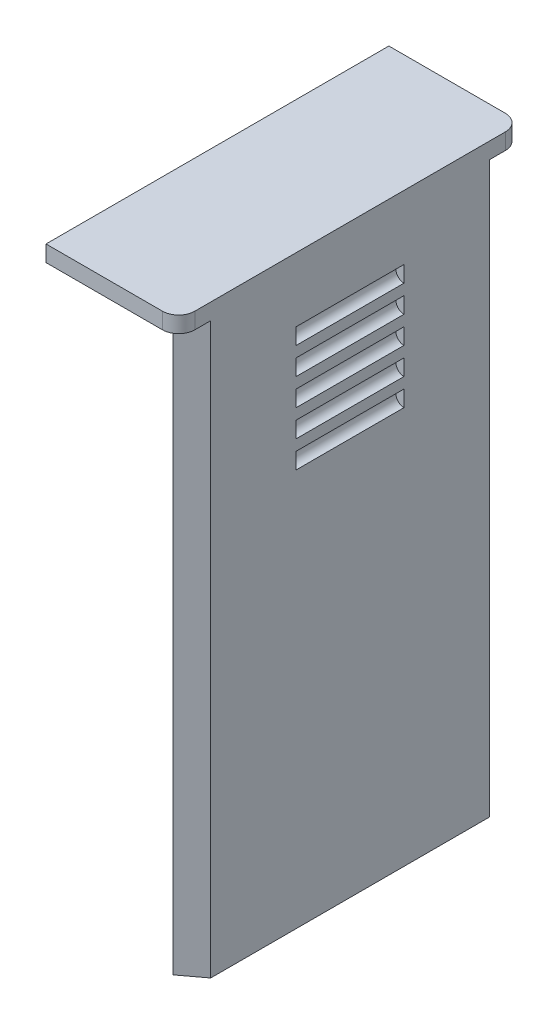
ISO-10303-21;
HEADER;
FILE_DESCRIPTION(('STEP AP214'),'2;1');
FILE_NAME('part.step','',(''),(''),'','','');
FILE_SCHEMA(('AUTOMOTIVE_DESIGN { 1 0 10303 214 1 1 1 1 }'));
ENDSEC;
DATA;
#1=APPLICATION_CONTEXT('core data for automotive mechanical design processes');
#2=APPLICATION_PROTOCOL_DEFINITION('international standard','automotive_design',2000,#1);
#3=PRODUCT_CONTEXT('',#1,'mechanical');
#4=PRODUCT('Part','Part','',(#3));
#5=PRODUCT_RELATED_PRODUCT_CATEGORY('part','',(#4));
#6=PRODUCT_DEFINITION_FORMATION('','',#4);
#7=PRODUCT_DEFINITION_CONTEXT('part definition',#1,'design');
#8=PRODUCT_DEFINITION('design','',#6,#7);
#9=PRODUCT_DEFINITION_SHAPE('','',#8);
#10=(LENGTH_UNIT() NAMED_UNIT(*) SI_UNIT(.MILLI.,.METRE.));
#11=(NAMED_UNIT(*) PLANE_ANGLE_UNIT() SI_UNIT($,.RADIAN.));
#12=(NAMED_UNIT(*) SI_UNIT($,.STERADIAN.) SOLID_ANGLE_UNIT());
#13=UNCERTAINTY_MEASURE_WITH_UNIT(LENGTH_MEASURE(1.E-05),#10,'distance_accuracy_value','');
#14=(GEOMETRIC_REPRESENTATION_CONTEXT(3) GLOBAL_UNCERTAINTY_ASSIGNED_CONTEXT((#13)) GLOBAL_UNIT_ASSIGNED_CONTEXT((#10,
#11,#12)) REPRESENTATION_CONTEXT('',''));
#15=CARTESIAN_POINT('',(0.,0.,0.));
#16=DIRECTION('',(0.,0.,1.));
#17=DIRECTION('',(1.,0.,0.));
#18=AXIS2_PLACEMENT_3D('',#15,#16,#17);
#19=CARTESIAN_POINT('',(-3.65222941321836,109.967949424705,104.21839123638));
#20=DIRECTION('',(1.,0.,0.));
#21=DIRECTION('',(0.,0.,-1.));
#22=AXIS2_PLACEMENT_3D('',#19,#20,#21);
#23=PLANE('',#22);
#24=DIRECTION('',(0.,0.,1.));
#25=VECTOR('',#24,1.);
#26=CARTESIAN_POINT('',(-3.65222941321836,98.017949424705,83.3183912363796));
#27=LINE('',#26,#25);
#28=CARTESIAN_POINT('',(-3.65222941321836,98.017949424705,83.3183912363796));
#29=VERTEX_POINT('',#28);
#30=CARTESIAN_POINT('',(-3.65222941321836,98.017949424705,93.3183912363796));
#31=VERTEX_POINT('',#30);
#32=EDGE_CURVE('E507',#29,#31,#27,.T.);
#33=ORIENTED_EDGE('',*,*,#32,.F.);
#34=DIRECTION('',(0.,-1.,0.));
#35=VECTOR('',#34,1.);
#36=CARTESIAN_POINT('',(-3.65222941321836,109.967949424705,83.3183912363796));
#37=LINE('',#36,#35);
#38=CARTESIAN_POINT('',(-3.65222941321836,96.517949424705,83.3183912363796));
#39=VERTEX_POINT('',#38);
#40=EDGE_CURVE('E205',#29,#39,#37,.T.);
#41=ORIENTED_EDGE('',*,*,#40,.T.);
#42=DIRECTION('',(0.,0.,1.));
#43=VECTOR('',#42,1.);
#44=CARTESIAN_POINT('',(-3.65222941321836,96.517949424705,83.3183912363796));
#45=LINE('',#44,#43);
#46=CARTESIAN_POINT('',(-3.65222941321836,96.517949424705,93.3183912363796));
#47=VERTEX_POINT('',#46);
#48=EDGE_CURVE('E506',#47,#39,#45,.F.);
#49=ORIENTED_EDGE('',*,*,#48,.F.);
#50=DIRECTION('',(0.,-1.,0.));
#51=VECTOR('',#50,1.);
#52=CARTESIAN_POINT('',(-3.65222941321836,109.967949424705,93.3183912363796));
#53=LINE('',#52,#51);
#54=EDGE_CURVE('E511',#31,#47,#53,.T.);
#55=ORIENTED_EDGE('',*,*,#54,.F.);
#56=EDGE_LOOP('',(#33,#41,#49,#55));
#57=FACE_BOUND('',#56,.T.);
#58=DIRECTION('',(0.,0.,1.));
#59=VECTOR('',#58,1.);
#60=CARTESIAN_POINT('',(-3.65222941321836,103.017949424705,83.3183912363796));
#61=LINE('',#60,#59);
#62=CARTESIAN_POINT('',(-3.65222941321836,103.017949424705,83.3183912363796));
#63=VERTEX_POINT('',#62);
#64=CARTESIAN_POINT('',(-3.65222941321836,103.017949424705,93.3183912363796));
#65=VERTEX_POINT('',#64);
#66=EDGE_CURVE('E526',#63,#65,#61,.T.);
#67=ORIENTED_EDGE('',*,*,#66,.F.);
#68=DIRECTION('',(0.,-1.,0.));
#69=VECTOR('',#68,1.);
#70=CARTESIAN_POINT('',(-3.65222941321836,109.967949424705,83.3183912363796));
#71=LINE('',#70,#69);
#72=CARTESIAN_POINT('',(-3.65222941321836,101.517949424705,83.3183912363796));
#73=VERTEX_POINT('',#72);
#74=EDGE_CURVE('E523',#63,#73,#71,.T.);
#75=ORIENTED_EDGE('',*,*,#74,.T.);
#76=DIRECTION('',(0.,0.,1.));
#77=VECTOR('',#76,1.);
#78=CARTESIAN_POINT('',(-3.65222941321836,101.517949424705,83.3183912363796));
#79=LINE('',#78,#77);
#80=CARTESIAN_POINT('',(-3.65222941321836,101.517949424705,93.3183912363796));
#81=VERTEX_POINT('',#80);
#82=EDGE_CURVE('E529',#81,#73,#79,.F.);
#83=ORIENTED_EDGE('',*,*,#82,.F.);
#84=DIRECTION('',(0.,-1.,0.));
#85=VECTOR('',#84,1.);
#86=CARTESIAN_POINT('',(-3.65222941321836,109.967949424705,93.3183912363796));
#87=LINE('',#86,#85);
#88=EDGE_CURVE('E531',#65,#81,#87,.T.);
#89=ORIENTED_EDGE('',*,*,#88,.F.);
#90=EDGE_LOOP('',(#67,#75,#83,#89));
#91=FACE_BOUND('',#90,.T.);
#92=DIRECTION('',(0.,0.,-1.));
#93=VECTOR('',#92,1.);
#94=CARTESIAN_POINT('',(-3.65222941321836,109.967949424705,104.21839123638));
#95=LINE('',#94,#93);
#96=CARTESIAN_POINT('',(-3.65222941321836,109.967949424705,75.3933912363796));
#97=VERTEX_POINT('',#96);
#98=CARTESIAN_POINT('',(-3.65222941321836,109.967949424705,73.9183912363796));
#99=VERTEX_POINT('',#98);
#100=EDGE_CURVE('E226',#97,#99,#95,.T.);
#101=ORIENTED_EDGE('',*,*,#100,.T.);
#102=DIRECTION('',(0.,1.,0.));
#103=VECTOR('',#102,1.);
#104=CARTESIAN_POINT('',(-3.65222941321836,109.967949424705,73.9183912363796));
#105=LINE('',#104,#103);
#106=CARTESIAN_POINT('',(-3.65222941321836,111.467949424705,73.9183912363796));
#107=VERTEX_POINT('',#106);
#108=EDGE_CURVE('E373',#99,#107,#105,.T.);
#109=ORIENTED_EDGE('',*,*,#108,.T.);
#110=DIRECTION('',(0.,0.,-1.));
#111=VECTOR('',#110,1.);
#112=CARTESIAN_POINT('',(-3.65222941321836,111.467949424705,104.21839123638));
#113=LINE('',#112,#111);
#114=CARTESIAN_POINT('',(-3.65222941321836,111.467949424705,102.71839123638));
#115=VERTEX_POINT('',#114);
#116=EDGE_CURVE('E252',#115,#107,#113,.T.);
#117=ORIENTED_EDGE('',*,*,#116,.F.);
#118=DIRECTION('',(0.,1.,0.));
#119=VECTOR('',#118,1.);
#120=CARTESIAN_POINT('',(-3.65222941321836,109.967949424705,102.71839123638));
#121=LINE('',#120,#119);
#122=CARTESIAN_POINT('',(-3.65222941321836,109.967949424705,102.71839123638));
#123=VERTEX_POINT('',#122);
#124=EDGE_CURVE('E221',#115,#123,#121,.F.);
#125=ORIENTED_EDGE('',*,*,#124,.T.);
#126=CARTESIAN_POINT('',(-3.65222941321836,109.967949424705,101.24339123638));
#127=VERTEX_POINT('',#126);
#128=EDGE_CURVE('E222',#123,#127,#95,.T.);
#129=ORIENTED_EDGE('',*,*,#128,.T.);
#130=DIRECTION('',(0.,1.,0.));
#131=VECTOR('',#130,1.);
#132=CARTESIAN_POINT('',(-3.65222941321836,57.167949424705,101.24339123638));
#133=LINE('',#132,#131);
#134=CARTESIAN_POINT('',(-3.65222941321836,57.167949424705,101.24339123638));
#135=VERTEX_POINT('',#134);
#136=EDGE_CURVE('E249',#135,#127,#133,.T.);
#137=ORIENTED_EDGE('',*,*,#136,.F.);
#138=DIRECTION('',(0.,0.,1.));
#139=VECTOR('',#138,1.);
#140=CARTESIAN_POINT('',(-3.65222941321836,57.167949424705,75.3933912363796));
#141=LINE('',#140,#139);
#142=CARTESIAN_POINT('',(-3.65222941321836,57.167949424705,75.3933912363796));
#143=VERTEX_POINT('',#142);
#144=EDGE_CURVE('E259',#143,#135,#141,.T.);
#145=ORIENTED_EDGE('',*,*,#144,.F.);
#146=DIRECTION('',(0.,1.,0.));
#147=VECTOR('',#146,1.);
#148=CARTESIAN_POINT('',(-3.65222941321836,57.167949424705,75.3933912363796));
#149=LINE('',#148,#147);
#150=EDGE_CURVE('E261',#143,#97,#149,.T.);
#151=ORIENTED_EDGE('',*,*,#150,.T.);
#152=EDGE_LOOP('',(#101,#109,#117,#125,#129,#137,#145,#151));
#153=FACE_BOUND('',#152,.T.);
#154=DIRECTION('',(0.,0.,1.));
#155=VECTOR('',#154,1.);
#156=CARTESIAN_POINT('',(-3.65222941321836,105.517949424705,83.3183912363796));
#157=LINE('',#156,#155);
#158=CARTESIAN_POINT('',(-3.65222941321836,105.517949424705,83.3183912363796));
#159=VERTEX_POINT('',#158);
#160=CARTESIAN_POINT('',(-3.65222941321836,105.517949424705,93.3183912363796));
#161=VERTEX_POINT('',#160);
#162=EDGE_CURVE('E536',#159,#161,#157,.T.);
#163=ORIENTED_EDGE('',*,*,#162,.F.);
#164=DIRECTION('',(0.,-1.,0.));
#165=VECTOR('',#164,1.);
#166=CARTESIAN_POINT('',(-3.65222941321836,109.967949424705,83.3183912363796));
#167=LINE('',#166,#165);
#168=CARTESIAN_POINT('',(-3.65222941321836,104.017949424705,83.3183912363796));
#169=VERTEX_POINT('',#168);
#170=EDGE_CURVE('E533',#159,#169,#167,.T.);
#171=ORIENTED_EDGE('',*,*,#170,.T.);
#172=DIRECTION('',(0.,0.,1.));
#173=VECTOR('',#172,1.);
#174=CARTESIAN_POINT('',(-3.65222941321836,104.017949424705,83.3183912363796));
#175=LINE('',#174,#173);
#176=CARTESIAN_POINT('',(-3.65222941321836,104.017949424705,93.3183912363796));
#177=VERTEX_POINT('',#176);
#178=EDGE_CURVE('E405',#177,#169,#175,.F.);
#179=ORIENTED_EDGE('',*,*,#178,.F.);
#180=DIRECTION('',(0.,-1.,0.));
#181=VECTOR('',#180,1.);
#182=CARTESIAN_POINT('',(-3.65222941321836,109.967949424705,93.3183912363796));
#183=LINE('',#182,#181);
#184=EDGE_CURVE('E402',#161,#177,#183,.T.);
#185=ORIENTED_EDGE('',*,*,#184,.F.);
#186=EDGE_LOOP('',(#163,#171,#179,#185));
#187=FACE_BOUND('',#186,.T.);
#188=DIRECTION('',(0.,0.,1.));
#189=VECTOR('',#188,1.);
#190=CARTESIAN_POINT('',(-3.65222941321836,100.517949424705,83.3183912363796));
#191=LINE('',#190,#189);
#192=CARTESIAN_POINT('',(-3.65222941321836,100.517949424705,83.3183912363796));
#193=VERTEX_POINT('',#192);
#194=CARTESIAN_POINT('',(-3.65222941321836,100.517949424705,93.3183912363796));
#195=VERTEX_POINT('',#194);
#196=EDGE_CURVE('E516',#193,#195,#191,.T.);
#197=ORIENTED_EDGE('',*,*,#196,.F.);
#198=DIRECTION('',(0.,-1.,0.));
#199=VECTOR('',#198,1.);
#200=CARTESIAN_POINT('',(-3.65222941321836,109.967949424705,83.3183912363796));
#201=LINE('',#200,#199);
#202=CARTESIAN_POINT('',(-3.65222941321836,99.017949424705,83.3183912363796));
#203=VERTEX_POINT('',#202);
#204=EDGE_CURVE('E513',#193,#203,#201,.T.);
#205=ORIENTED_EDGE('',*,*,#204,.T.);
#206=DIRECTION('',(0.,0.,1.));
#207=VECTOR('',#206,1.);
#208=CARTESIAN_POINT('',(-3.65222941321836,99.017949424705,83.3183912363796));
#209=LINE('',#208,#207);
#210=CARTESIAN_POINT('',(-3.65222941321836,99.017949424705,93.3183912363796));
#211=VERTEX_POINT('',#210);
#212=EDGE_CURVE('E519',#211,#203,#209,.F.);
#213=ORIENTED_EDGE('',*,*,#212,.F.);
#214=DIRECTION('',(0.,-1.,0.));
#215=VECTOR('',#214,1.);
#216=CARTESIAN_POINT('',(-3.65222941321836,109.967949424705,93.3183912363796));
#217=LINE('',#216,#215);
#218=EDGE_CURVE('E521',#195,#211,#217,.T.);
#219=ORIENTED_EDGE('',*,*,#218,.F.);
#220=EDGE_LOOP('',(#197,#205,#213,#219));
#221=FACE_BOUND('',#220,.T.);
#222=DIRECTION('',(0.,0.,1.));
#223=VECTOR('',#222,1.);
#224=CARTESIAN_POINT('',(-3.65222941321836,95.517949424705,83.3183912363796));
#225=LINE('',#224,#223);
#226=CARTESIAN_POINT('',(-3.65222941321836,95.517949424705,83.3183912363796));
#227=VERTEX_POINT('',#226);
#228=CARTESIAN_POINT('',(-3.65222941321836,95.517949424705,93.3183912363796));
#229=VERTEX_POINT('',#228);
#230=EDGE_CURVE('E211',#227,#229,#225,.T.);
#231=ORIENTED_EDGE('',*,*,#230,.F.);
#232=DIRECTION('',(0.,-1.,0.));
#233=VECTOR('',#232,1.);
#234=CARTESIAN_POINT('',(-3.65222941321836,109.967949424705,83.3183912363796));
#235=LINE('',#234,#233);
#236=CARTESIAN_POINT('',(-3.65222941321836,94.017949424705,83.3183912363796));
#237=VERTEX_POINT('',#236);
#238=EDGE_CURVE('E215',#227,#237,#235,.T.);
#239=ORIENTED_EDGE('',*,*,#238,.T.);
#240=DIRECTION('',(0.,0.,1.));
#241=VECTOR('',#240,1.);
#242=CARTESIAN_POINT('',(-3.65222941321836,94.017949424705,83.3183912363796));
#243=LINE('',#242,#241);
#244=CARTESIAN_POINT('',(-3.65222941321836,94.017949424705,93.3183912363796));
#245=VERTEX_POINT('',#244);
#246=EDGE_CURVE('E204',#245,#237,#243,.F.);
#247=ORIENTED_EDGE('',*,*,#246,.F.);
#248=DIRECTION('',(0.,-1.,0.));
#249=VECTOR('',#248,1.);
#250=CARTESIAN_POINT('',(-3.65222941321836,109.967949424705,93.3183912363796));
#251=LINE('',#250,#249);
#252=EDGE_CURVE('E196',#229,#245,#251,.T.);
#253=ORIENTED_EDGE('',*,*,#252,.F.);
#254=EDGE_LOOP('',(#231,#239,#247,#253));
#255=FACE_BOUND('',#254,.T.);
#256=ADVANCED_FACE('F33',(#57,#91,#153,#187,#221,#255),#23,.T.);
#257=CARTESIAN_POINT('',(0.,109.967949424705,0.));
#258=DIRECTION('',(0.,1.,0.));
#259=DIRECTION('',(0.,0.,1.));
#260=AXIS2_PLACEMENT_3D('',#257,#258,#259);
#261=PLANE('',#260);
#262=DIRECTION('',(-1.,0.,0.));
#263=VECTOR('',#262,1.);
#264=CARTESIAN_POINT('',(-3.65222941321836,109.967949424705,72.4183912363796));
#265=LINE('',#264,#263);
#266=CARTESIAN_POINT('',(-5.15222941321836,109.967949424705,72.4183912363796));
#267=VERTEX_POINT('',#266);
#268=CARTESIAN_POINT('',(-15.9522294132184,109.967949424705,72.4183912363796));
#269=VERTEX_POINT('',#268);
#270=EDGE_CURVE('E225',#267,#269,#265,.T.);
#271=ORIENTED_EDGE('',*,*,#270,.F.);
#272=CARTESIAN_POINT('',(-5.15222941321836,109.967949424705,73.9183912363796));
#273=DIRECTION('',(0.,1.,0.));
#274=DIRECTION('',(0.,0.,1.));
#275=AXIS2_PLACEMENT_3D('',#272,#273,#274);
#276=CIRCLE('',#275,1.5);
#277=EDGE_CURVE('E41',#267,#99,#276,.F.);
#278=ORIENTED_EDGE('',*,*,#277,.T.);
#279=ORIENTED_EDGE('',*,*,#100,.F.);
#280=DIRECTION('',(0.799999999999999,0.,0.600000000000001));
#281=VECTOR('',#280,1.);
#282=CARTESIAN_POINT('',(-3.65222941321836,109.967949424705,75.3933912363796));
#283=LINE('',#282,#281);
#284=CARTESIAN_POINT('',(-5.65222941321836,109.967949424705,73.8933912363796));
#285=VERTEX_POINT('',#284);
#286=EDGE_CURVE('E255',#285,#97,#283,.T.);
#287=ORIENTED_EDGE('',*,*,#286,.F.);
#288=DIRECTION('',(0.,0.,-1.));
#289=VECTOR('',#288,1.);
#290=CARTESIAN_POINT('',(-5.65222941321836,109.967949424705,102.74339123638));
#291=LINE('',#290,#289);
#292=CARTESIAN_POINT('',(-5.65222941321836,109.967949424705,80.8183912363796));
#293=VERTEX_POINT('',#292);
#294=EDGE_CURVE('E245',#293,#285,#291,.T.);
#295=ORIENTED_EDGE('',*,*,#294,.F.);
#296=DIRECTION('',(1.,0.,0.));
#297=VECTOR('',#296,1.);
#298=CARTESIAN_POINT('',(-5.65222941321836,109.967949424705,80.8183912363796));
#299=LINE('',#298,#297);
#300=CARTESIAN_POINT('',(-6.65222941321836,109.967949424705,80.8183912363796));
#301=VERTEX_POINT('',#300);
#302=EDGE_CURVE('E296',#301,#293,#299,.T.);
#303=ORIENTED_EDGE('',*,*,#302,.F.);
#304=DIRECTION('',(0.,0.,-1.));
#305=VECTOR('',#304,1.);
#306=CARTESIAN_POINT('',(-6.65222941321836,109.967949424705,95.8183912363796));
#307=LINE('',#306,#305);
#308=CARTESIAN_POINT('',(-6.65222941321836,109.967949424705,95.8183912363796));
#309=VERTEX_POINT('',#308);
#310=EDGE_CURVE('E300',#309,#301,#307,.T.);
#311=ORIENTED_EDGE('',*,*,#310,.F.);
#312=DIRECTION('',(-1.,0.,0.));
#313=VECTOR('',#312,1.);
#314=CARTESIAN_POINT('',(-5.65222941321836,109.967949424705,95.8183912363796));
#315=LINE('',#314,#313);
#316=CARTESIAN_POINT('',(-5.65222941321836,109.967949424705,95.8183912363796));
#317=VERTEX_POINT('',#316);
#318=EDGE_CURVE('E303',#317,#309,#315,.T.);
#319=ORIENTED_EDGE('',*,*,#318,.F.);
#320=CARTESIAN_POINT('',(-5.65222941321836,109.967949424705,102.74339123638));
#321=VERTEX_POINT('',#320);
#322=EDGE_CURVE('E260',#321,#317,#291,.T.);
#323=ORIENTED_EDGE('',*,*,#322,.F.);
#324=DIRECTION('',(-0.799999999999999,0.,0.600000000000001));
#325=VECTOR('',#324,1.);
#326=CARTESIAN_POINT('',(-3.65222941321836,109.967949424705,101.24339123638));
#327=LINE('',#326,#325);
#328=EDGE_CURVE('E242',#127,#321,#327,.T.);
#329=ORIENTED_EDGE('',*,*,#328,.F.);
#330=ORIENTED_EDGE('',*,*,#128,.F.);
#331=CARTESIAN_POINT('',(-5.15222941321836,109.967949424705,102.71839123638));
#332=DIRECTION('',(0.,1.,0.));
#333=DIRECTION('',(0.,0.,1.));
#334=AXIS2_PLACEMENT_3D('',#331,#332,#333);
#335=CIRCLE('',#334,1.5);
#336=CARTESIAN_POINT('',(-5.15222941321836,109.967949424705,104.21839123638));
#337=VERTEX_POINT('',#336);
#338=EDGE_CURVE('E48',#123,#337,#335,.F.);
#339=ORIENTED_EDGE('',*,*,#338,.T.);
#340=DIRECTION('',(1.,0.,0.));
#341=VECTOR('',#340,1.);
#342=CARTESIAN_POINT('',(-15.9522294132184,109.967949424705,104.21839123638));
#343=LINE('',#342,#341);
#344=CARTESIAN_POINT('',(-15.9522294132184,109.967949424705,104.21839123638));
#345=VERTEX_POINT('',#344);
#346=EDGE_CURVE('E391',#345,#337,#343,.T.);
#347=ORIENTED_EDGE('',*,*,#346,.F.);
#348=DIRECTION('',(0.,0.,1.));
#349=VECTOR('',#348,1.);
#350=CARTESIAN_POINT('',(-15.9522294132184,109.967949424705,72.4183912363796));
#351=LINE('',#350,#349);
#352=EDGE_CURVE('E409',#269,#345,#351,.T.);
#353=ORIENTED_EDGE('',*,*,#352,.F.);
#354=EDGE_LOOP('',(#271,#278,#279,#287,#295,#303,#311,#319,#323,#329,#330,#339,#347,#353));
#355=FACE_BOUND('',#354,.T.);
#356=ADVANCED_FACE('F351',(#355),#261,.F.);
#357=CARTESIAN_POINT('',(-5.65222941321836,57.167949424705,102.74339123638));
#358=DIRECTION('',(1.,0.,0.));
#359=DIRECTION('',(0.,0.,-1.));
#360=AXIS2_PLACEMENT_3D('',#357,#358,#359);
#361=PLANE('',#360);
#362=DIRECTION('',(0.,1.,0.));
#363=VECTOR('',#362,1.);
#364=CARTESIAN_POINT('',(-5.65222941321836,89.967949424705,95.8183912363796));
#365=LINE('',#364,#363);
#366=CARTESIAN_POINT('',(-5.65222941321836,89.967949424705,95.8183912363796));
#367=VERTEX_POINT('',#366);
#368=EDGE_CURVE('E246',#367,#317,#365,.T.);
#369=ORIENTED_EDGE('',*,*,#368,.F.);
#370=DIRECTION('',(0.,0.,1.));
#371=VECTOR('',#370,1.);
#372=CARTESIAN_POINT('',(-5.65222941321836,89.967949424705,95.8183912363796));
#373=LINE('',#372,#371);
#374=CARTESIAN_POINT('',(-5.65222941321836,89.967949424705,80.8183912363796));
#375=VERTEX_POINT('',#374);
#376=EDGE_CURVE('E299',#375,#367,#373,.T.);
#377=ORIENTED_EDGE('',*,*,#376,.F.);
#378=DIRECTION('',(0.,1.,0.));
#379=VECTOR('',#378,1.);
#380=CARTESIAN_POINT('',(-5.65222941321836,89.967949424705,80.8183912363796));
#381=LINE('',#380,#379);
#382=EDGE_CURVE('E293',#375,#293,#381,.T.);
#383=ORIENTED_EDGE('',*,*,#382,.T.);
#384=ORIENTED_EDGE('',*,*,#294,.T.);
#385=DIRECTION('',(0.,1.,0.));
#386=VECTOR('',#385,1.);
#387=CARTESIAN_POINT('',(-5.65222941321836,57.167949424705,73.8933912363796));
#388=LINE('',#387,#386);
#389=CARTESIAN_POINT('',(-5.65222941321836,57.167949424705,73.8933912363796));
#390=VERTEX_POINT('',#389);
#391=EDGE_CURVE('E266',#390,#285,#388,.T.);
#392=ORIENTED_EDGE('',*,*,#391,.F.);
#393=DIRECTION('',(0.,0.,-1.));
#394=VECTOR('',#393,1.);
#395=CARTESIAN_POINT('',(-5.65222941321836,57.167949424705,102.74339123638));
#396=LINE('',#395,#394);
#397=CARTESIAN_POINT('',(-5.65222941321836,57.167949424705,102.74339123638));
#398=VERTEX_POINT('',#397);
#399=EDGE_CURVE('E277',#398,#390,#396,.T.);
#400=ORIENTED_EDGE('',*,*,#399,.F.);
#401=DIRECTION('',(0.,1.,0.));
#402=VECTOR('',#401,1.);
#403=CARTESIAN_POINT('',(-5.65222941321836,57.167949424705,102.74339123638));
#404=LINE('',#403,#402);
#405=EDGE_CURVE('E231',#398,#321,#404,.T.);
#406=ORIENTED_EDGE('',*,*,#405,.T.);
#407=ORIENTED_EDGE('',*,*,#322,.T.);
#408=EDGE_LOOP('',(#369,#377,#383,#384,#392,#400,#406,#407));
#409=FACE_BOUND('',#408,.T.);
#410=ADVANCED_FACE('F357',(#409),#361,.F.);
#411=CARTESIAN_POINT('',(-15.9522294132184,109.967949424705,104.21839123638));
#412=DIRECTION('',(0.,0.,1.));
#413=DIRECTION('',(1.,0.,0.));
#414=AXIS2_PLACEMENT_3D('',#411,#412,#413);
#415=PLANE('',#414);
#416=ORIENTED_EDGE('',*,*,#346,.T.);
#417=DIRECTION('',(0.,1.,0.));
#418=VECTOR('',#417,1.);
#419=CARTESIAN_POINT('',(-5.15222941321836,109.967949424705,104.21839123638));
#420=LINE('',#419,#418);
#421=CARTESIAN_POINT('',(-5.15222941321836,111.467949424705,104.21839123638));
#422=VERTEX_POINT('',#421);
#423=EDGE_CURVE('E11',#337,#422,#420,.T.);
#424=ORIENTED_EDGE('',*,*,#423,.T.);
#425=DIRECTION('',(1.,0.,0.));
#426=VECTOR('',#425,1.);
#427=CARTESIAN_POINT('',(-15.9522294132184,111.467949424705,104.21839123638));
#428=LINE('',#427,#426);
#429=CARTESIAN_POINT('',(-15.9522294132184,111.467949424705,104.21839123638));
#430=VERTEX_POINT('',#429);
#431=EDGE_CURVE('E239',#430,#422,#428,.T.);
#432=ORIENTED_EDGE('',*,*,#431,.F.);
#433=DIRECTION('',(0.,1.,0.));
#434=VECTOR('',#433,1.);
#435=CARTESIAN_POINT('',(-15.9522294132184,109.967949424705,104.21839123638));
#436=LINE('',#435,#434);
#437=EDGE_CURVE('E401',#345,#430,#436,.T.);
#438=ORIENTED_EDGE('',*,*,#437,.F.);
#439=EDGE_LOOP('',(#416,#424,#432,#438));
#440=FACE_BOUND('',#439,.T.);
#441=ADVANCED_FACE('F390',(#440),#415,.T.);
#442=CARTESIAN_POINT('',(-15.9522294132184,109.967949424705,72.4183912363796));
#443=DIRECTION('',(-1.,0.,0.));
#444=DIRECTION('',(0.,0.,1.));
#445=AXIS2_PLACEMENT_3D('',#442,#443,#444);
#446=PLANE('',#445);
#447=DIRECTION('',(0.,0.,1.));
#448=VECTOR('',#447,1.);
#449=CARTESIAN_POINT('',(-15.9522294132184,111.467949424705,72.4183912363796));
#450=LINE('',#449,#448);
#451=CARTESIAN_POINT('',(-15.9522294132184,111.467949424705,72.4183912363796));
#452=VERTEX_POINT('',#451);
#453=EDGE_CURVE('E396',#452,#430,#450,.T.);
#454=ORIENTED_EDGE('',*,*,#453,.F.);
#455=DIRECTION('',(0.,1.,0.));
#456=VECTOR('',#455,1.);
#457=CARTESIAN_POINT('',(-15.9522294132184,109.967949424705,72.4183912363796));
#458=LINE('',#457,#456);
#459=EDGE_CURVE('E240',#269,#452,#458,.T.);
#460=ORIENTED_EDGE('',*,*,#459,.F.);
#461=ORIENTED_EDGE('',*,*,#352,.T.);
#462=ORIENTED_EDGE('',*,*,#437,.T.);
#463=EDGE_LOOP('',(#454,#460,#461,#462));
#464=FACE_BOUND('',#463,.T.);
#465=ADVANCED_FACE('F413',(#464),#446,.T.);
#466=CARTESIAN_POINT('',(-3.65222941321836,109.967949424705,72.4183912363796));
#467=DIRECTION('',(0.,0.,-1.));
#468=DIRECTION('',(-1.,0.,0.));
#469=AXIS2_PLACEMENT_3D('',#466,#467,#468);
#470=PLANE('',#469);
#471=DIRECTION('',(-1.,0.,0.));
#472=VECTOR('',#471,1.);
#473=CARTESIAN_POINT('',(-3.65222941321836,111.467949424705,72.4183912363796));
#474=LINE('',#473,#472);
#475=CARTESIAN_POINT('',(-5.15222941321836,111.467949424705,72.4183912363796));
#476=VERTEX_POINT('',#475);
#477=EDGE_CURVE('E398',#476,#452,#474,.T.);
#478=ORIENTED_EDGE('',*,*,#477,.F.);
#479=DIRECTION('',(0.,1.,0.));
#480=VECTOR('',#479,1.);
#481=CARTESIAN_POINT('',(-5.15222941321836,109.967949424705,72.4183912363796));
#482=LINE('',#481,#480);
#483=EDGE_CURVE('E56',#476,#267,#482,.F.);
#484=ORIENTED_EDGE('',*,*,#483,.T.);
#485=ORIENTED_EDGE('',*,*,#270,.T.);
#486=ORIENTED_EDGE('',*,*,#459,.T.);
#487=EDGE_LOOP('',(#478,#484,#485,#486));
#488=FACE_BOUND('',#487,.T.);
#489=ADVANCED_FACE('F362',(#488),#470,.T.);
#490=CARTESIAN_POINT('',(0.,111.467949424705,0.));
#491=DIRECTION('',(0.,1.,0.));
#492=DIRECTION('',(0.,0.,1.));
#493=AXIS2_PLACEMENT_3D('',#490,#491,#492);
#494=PLANE('',#493);
#495=ORIENTED_EDGE('',*,*,#116,.T.);
#496=CARTESIAN_POINT('',(-5.15222941321836,111.467949424705,73.9183912363796));
#497=DIRECTION('',(0.,1.,0.));
#498=DIRECTION('',(0.,0.,1.));
#499=AXIS2_PLACEMENT_3D('',#496,#497,#498);
#500=CIRCLE('',#499,1.5);
#501=EDGE_CURVE('E377',#107,#476,#500,.T.);
#502=ORIENTED_EDGE('',*,*,#501,.T.);
#503=ORIENTED_EDGE('',*,*,#477,.T.);
#504=ORIENTED_EDGE('',*,*,#453,.T.);
#505=ORIENTED_EDGE('',*,*,#431,.T.);
#506=CARTESIAN_POINT('',(-5.15222941321836,111.467949424705,102.71839123638));
#507=DIRECTION('',(0.,1.,0.));
#508=DIRECTION('',(0.,0.,1.));
#509=AXIS2_PLACEMENT_3D('',#506,#507,#508);
#510=CIRCLE('',#509,1.5);
#511=EDGE_CURVE('E379',#422,#115,#510,.T.);
#512=ORIENTED_EDGE('',*,*,#511,.T.);
#513=EDGE_LOOP('',(#495,#502,#503,#504,#505,#512));
#514=FACE_BOUND('',#513,.T.);
#515=ADVANCED_FACE('F394',(#514),#494,.T.);
#516=CARTESIAN_POINT('',(-3.65222941321836,57.167949424705,101.24339123638));
#517=DIRECTION('',(-0.600000000000001,0.,-0.799999999999999));
#518=DIRECTION('',(-0.799999999999999,0.,0.600000000000001));
#519=AXIS2_PLACEMENT_3D('',#516,#517,#518);
#520=PLANE('',#519);
#521=ORIENTED_EDGE('',*,*,#328,.T.);
#522=ORIENTED_EDGE('',*,*,#405,.F.);
#523=DIRECTION('',(-0.799999999999999,0.,0.600000000000001));
#524=VECTOR('',#523,1.);
#525=CARTESIAN_POINT('',(-3.65222941321836,57.167949424705,101.24339123638));
#526=LINE('',#525,#524);
#527=EDGE_CURVE('E280',#135,#398,#526,.T.);
#528=ORIENTED_EDGE('',*,*,#527,.F.);
#529=ORIENTED_EDGE('',*,*,#136,.T.);
#530=EDGE_LOOP('',(#521,#522,#528,#529));
#531=FACE_BOUND('',#530,.T.);
#532=ADVANCED_FACE('F418',(#531),#520,.F.);
#533=CARTESIAN_POINT('',(-3.65222941321836,57.167949424705,75.3933912363796));
#534=DIRECTION('',(-0.600000000000001,0.,0.799999999999999));
#535=DIRECTION('',(0.799999999999999,0.,0.600000000000001));
#536=AXIS2_PLACEMENT_3D('',#533,#534,#535);
#537=PLANE('',#536);
#538=ORIENTED_EDGE('',*,*,#286,.T.);
#539=ORIENTED_EDGE('',*,*,#150,.F.);
#540=DIRECTION('',(0.799999999999999,0.,0.600000000000001));
#541=VECTOR('',#540,1.);
#542=CARTESIAN_POINT('',(-3.65222941321836,57.167949424705,75.3933912363796));
#543=LINE('',#542,#541);
#544=EDGE_CURVE('E273',#390,#143,#543,.T.);
#545=ORIENTED_EDGE('',*,*,#544,.F.);
#546=ORIENTED_EDGE('',*,*,#391,.T.);
#547=EDGE_LOOP('',(#538,#539,#545,#546));
#548=FACE_BOUND('',#547,.T.);
#549=ADVANCED_FACE('F427',(#548),#537,.F.);
#550=CARTESIAN_POINT('',(0.,57.167949424705,0.));
#551=DIRECTION('',(0.,-1.,0.));
#552=DIRECTION('',(0.,0.,-1.));
#553=AXIS2_PLACEMENT_3D('',#550,#551,#552);
#554=PLANE('',#553);
#555=ORIENTED_EDGE('',*,*,#144,.T.);
#556=ORIENTED_EDGE('',*,*,#527,.T.);
#557=ORIENTED_EDGE('',*,*,#399,.T.);
#558=ORIENTED_EDGE('',*,*,#544,.T.);
#559=EDGE_LOOP('',(#555,#556,#557,#558));
#560=FACE_BOUND('',#559,.T.);
#561=ADVANCED_FACE('F434',(#560),#554,.T.);
#562=CARTESIAN_POINT('',(-5.65222941321836,89.967949424705,95.8183912363796));
#563=DIRECTION('',(0.,0.,-1.));
#564=DIRECTION('',(-1.,0.,0.));
#565=AXIS2_PLACEMENT_3D('',#562,#563,#564);
#566=PLANE('',#565);
#567=ORIENTED_EDGE('',*,*,#318,.T.);
#568=DIRECTION('',(0.,1.,0.));
#569=VECTOR('',#568,1.);
#570=CARTESIAN_POINT('',(-6.65222941321836,89.967949424705,95.8183912363796));
#571=LINE('',#570,#569);
#572=CARTESIAN_POINT('',(-6.65222941321836,89.967949424705,95.8183912363796));
#573=VERTEX_POINT('',#572);
#574=EDGE_CURVE('E287',#573,#309,#571,.T.);
#575=ORIENTED_EDGE('',*,*,#574,.F.);
#576=DIRECTION('',(-1.,0.,0.));
#577=VECTOR('',#576,1.);
#578=CARTESIAN_POINT('',(-5.65222941321836,89.967949424705,95.8183912363796));
#579=LINE('',#578,#577);
#580=EDGE_CURVE('E311',#367,#573,#579,.T.);
#581=ORIENTED_EDGE('',*,*,#580,.F.);
#582=ORIENTED_EDGE('',*,*,#368,.T.);
#583=EDGE_LOOP('',(#567,#575,#581,#582));
#584=FACE_BOUND('',#583,.T.);
#585=ADVANCED_FACE('F437',(#584),#566,.F.);
#586=CARTESIAN_POINT('',(-6.65222941321836,89.967949424705,95.8183912363796));
#587=DIRECTION('',(1.,0.,0.));
#588=DIRECTION('',(0.,0.,-1.));
#589=AXIS2_PLACEMENT_3D('',#586,#587,#588);
#590=PLANE('',#589);
#591=ORIENTED_EDGE('',*,*,#310,.T.);
#592=DIRECTION('',(0.,1.,0.));
#593=VECTOR('',#592,1.);
#594=CARTESIAN_POINT('',(-6.65222941321836,89.967949424705,80.8183912363796));
#595=LINE('',#594,#593);
#596=CARTESIAN_POINT('',(-6.65222941321836,89.967949424705,80.8183912363796));
#597=VERTEX_POINT('',#596);
#598=EDGE_CURVE('E290',#597,#301,#595,.T.);
#599=ORIENTED_EDGE('',*,*,#598,.F.);
#600=DIRECTION('',(0.,0.,-1.));
#601=VECTOR('',#600,1.);
#602=CARTESIAN_POINT('',(-6.65222941321836,89.967949424705,95.8183912363796));
#603=LINE('',#602,#601);
#604=EDGE_CURVE('E309',#573,#597,#603,.T.);
#605=ORIENTED_EDGE('',*,*,#604,.F.);
#606=ORIENTED_EDGE('',*,*,#574,.T.);
#607=EDGE_LOOP('',(#591,#599,#605,#606));
#608=FACE_BOUND('',#607,.T.);
#609=ADVANCED_FACE('F440',(#608),#590,.F.);
#610=CARTESIAN_POINT('',(-5.65222941321836,89.967949424705,80.8183912363796));
#611=DIRECTION('',(0.,0.,1.));
#612=DIRECTION('',(1.,0.,0.));
#613=AXIS2_PLACEMENT_3D('',#610,#611,#612);
#614=PLANE('',#613);
#615=ORIENTED_EDGE('',*,*,#302,.T.);
#616=ORIENTED_EDGE('',*,*,#382,.F.);
#617=DIRECTION('',(1.,0.,0.));
#618=VECTOR('',#617,1.);
#619=CARTESIAN_POINT('',(-5.65222941321836,89.967949424705,80.8183912363796));
#620=LINE('',#619,#618);
#621=EDGE_CURVE('E295',#597,#375,#620,.T.);
#622=ORIENTED_EDGE('',*,*,#621,.F.);
#623=ORIENTED_EDGE('',*,*,#598,.T.);
#624=EDGE_LOOP('',(#615,#616,#622,#623));
#625=FACE_BOUND('',#624,.T.);
#626=ADVANCED_FACE('F444',(#625),#614,.F.);
#627=CARTESIAN_POINT('',(0.,89.967949424705,0.));
#628=DIRECTION('',(0.,1.,0.));
#629=DIRECTION('',(0.,0.,1.));
#630=AXIS2_PLACEMENT_3D('',#627,#628,#629);
#631=PLANE('',#630);
#632=ORIENTED_EDGE('',*,*,#376,.T.);
#633=ORIENTED_EDGE('',*,*,#580,.T.);
#634=ORIENTED_EDGE('',*,*,#604,.T.);
#635=ORIENTED_EDGE('',*,*,#621,.T.);
#636=EDGE_LOOP('',(#632,#633,#634,#635));
#637=FACE_BOUND('',#636,.T.);
#638=ADVANCED_FACE('F448',(#637),#631,.F.);
#639=CARTESIAN_POINT('',(-3.65222941321836,104.767949424705,83.3183912363796));
#640=DIRECTION('',(0.,0.,1.));
#641=DIRECTION('',(1.,0.,0.));
#642=AXIS2_PLACEMENT_3D('',#639,#640,#641);
#643=CYLINDRICAL_SURFACE('',#642,0.749999999999999);
#644=ORIENTED_EDGE('',*,*,#162,.T.);
#645=CARTESIAN_POINT('',(-3.65222941321836,104.767949424705,93.3183912363796));
#646=DIRECTION('',(0.,0.,1.));
#647=DIRECTION('',(1.,0.,0.));
#648=AXIS2_PLACEMENT_3D('',#645,#646,#647);
#649=CIRCLE('',#648,0.749999999999999);
#650=EDGE_CURVE('E315',#161,#177,#649,.T.);
#651=ORIENTED_EDGE('',*,*,#650,.T.);
#652=ORIENTED_EDGE('',*,*,#178,.T.);
#653=CARTESIAN_POINT('',(-3.65222941321836,104.767949424705,83.3183912363796));
#654=DIRECTION('',(0.,0.,1.));
#655=DIRECTION('',(1.,0.,0.));
#656=AXIS2_PLACEMENT_3D('',#653,#654,#655);
#657=CIRCLE('',#656,0.749999999999999);
#658=EDGE_CURVE('E306',#159,#169,#657,.T.);
#659=ORIENTED_EDGE('',*,*,#658,.F.);
#660=EDGE_LOOP('',(#644,#651,#652,#659));
#661=FACE_BOUND('',#660,.T.);
#662=ADVANCED_FACE('F452',(#661),#643,.F.);
#663=CARTESIAN_POINT('',(-3.65222941321836,104.767949424705,83.3183912363796));
#664=DIRECTION('',(0.,0.,1.));
#665=DIRECTION('',(1.,0.,0.));
#666=AXIS2_PLACEMENT_3D('',#663,#664,#665);
#667=PLANE('',#666);
#668=ORIENTED_EDGE('',*,*,#658,.T.);
#669=ORIENTED_EDGE('',*,*,#170,.F.);
#670=EDGE_LOOP('',(#668,#669));
#671=FACE_BOUND('',#670,.T.);
#672=ADVANCED_FACE('F456',(#671),#667,.T.);
#673=CARTESIAN_POINT('',(-3.65222941321836,104.767949424705,93.3183912363796));
#674=DIRECTION('',(0.,0.,1.));
#675=DIRECTION('',(1.,0.,0.));
#676=AXIS2_PLACEMENT_3D('',#673,#674,#675);
#677=PLANE('',#676);
#678=ORIENTED_EDGE('',*,*,#184,.T.);
#679=ORIENTED_EDGE('',*,*,#650,.F.);
#680=EDGE_LOOP('',(#678,#679));
#681=FACE_BOUND('',#680,.T.);
#682=ADVANCED_FACE('F458',(#681),#677,.F.);
#683=CARTESIAN_POINT('',(-3.65222941321836,102.267949424705,83.3183912363796));
#684=DIRECTION('',(0.,0.,1.));
#685=DIRECTION('',(1.,0.,0.));
#686=AXIS2_PLACEMENT_3D('',#683,#684,#685);
#687=CYLINDRICAL_SURFACE('',#686,0.749999999999999);
#688=ORIENTED_EDGE('',*,*,#66,.T.);
#689=CARTESIAN_POINT('',(-3.65222941321836,102.267949424705,93.3183912363796));
#690=DIRECTION('',(0.,0.,1.));
#691=DIRECTION('',(1.,0.,0.));
#692=AXIS2_PLACEMENT_3D('',#689,#690,#691);
#693=CIRCLE('',#692,0.749999999999999);
#694=EDGE_CURVE('E321',#65,#81,#693,.T.);
#695=ORIENTED_EDGE('',*,*,#694,.T.);
#696=ORIENTED_EDGE('',*,*,#82,.T.);
#697=CARTESIAN_POINT('',(-3.65222941321836,102.267949424705,83.3183912363796));
#698=DIRECTION('',(0.,0.,1.));
#699=DIRECTION('',(1.,0.,0.));
#700=AXIS2_PLACEMENT_3D('',#697,#698,#699);
#701=CIRCLE('',#700,0.749999999999999);
#702=EDGE_CURVE('E318',#63,#73,#701,.T.);
#703=ORIENTED_EDGE('',*,*,#702,.F.);
#704=EDGE_LOOP('',(#688,#695,#696,#703));
#705=FACE_BOUND('',#704,.T.);
#706=ADVANCED_FACE('F461',(#705),#687,.F.);
#707=CARTESIAN_POINT('',(-3.65222941321836,102.267949424705,83.3183912363796));
#708=DIRECTION('',(0.,0.,1.));
#709=DIRECTION('',(1.,0.,0.));
#710=AXIS2_PLACEMENT_3D('',#707,#708,#709);
#711=PLANE('',#710);
#712=ORIENTED_EDGE('',*,*,#702,.T.);
#713=ORIENTED_EDGE('',*,*,#74,.F.);
#714=EDGE_LOOP('',(#712,#713));
#715=FACE_BOUND('',#714,.T.);
#716=ADVANCED_FACE('F468',(#715),#711,.T.);
#717=CARTESIAN_POINT('',(-3.65222941321836,102.267949424705,93.3183912363796));
#718=DIRECTION('',(0.,0.,1.));
#719=DIRECTION('',(1.,0.,0.));
#720=AXIS2_PLACEMENT_3D('',#717,#718,#719);
#721=PLANE('',#720);
#722=ORIENTED_EDGE('',*,*,#88,.T.);
#723=ORIENTED_EDGE('',*,*,#694,.F.);
#724=EDGE_LOOP('',(#722,#723));
#725=FACE_BOUND('',#724,.T.);
#726=ADVANCED_FACE('F470',(#725),#721,.F.);
#727=CARTESIAN_POINT('',(-3.65222941321836,99.767949424705,83.3183912363796));
#728=DIRECTION('',(0.,0.,1.));
#729=DIRECTION('',(1.,0.,0.));
#730=AXIS2_PLACEMENT_3D('',#727,#728,#729);
#731=CYLINDRICAL_SURFACE('',#730,0.749999999999999);
#732=ORIENTED_EDGE('',*,*,#196,.T.);
#733=CARTESIAN_POINT('',(-3.65222941321836,99.767949424705,93.3183912363796));
#734=DIRECTION('',(0.,0.,1.));
#735=DIRECTION('',(1.,0.,0.));
#736=AXIS2_PLACEMENT_3D('',#733,#734,#735);
#737=CIRCLE('',#736,0.749999999999999);
#738=EDGE_CURVE('E327',#195,#211,#737,.T.);
#739=ORIENTED_EDGE('',*,*,#738,.T.);
#740=ORIENTED_EDGE('',*,*,#212,.T.);
#741=CARTESIAN_POINT('',(-3.65222941321836,99.767949424705,83.3183912363796));
#742=DIRECTION('',(0.,0.,1.));
#743=DIRECTION('',(1.,0.,0.));
#744=AXIS2_PLACEMENT_3D('',#741,#742,#743);
#745=CIRCLE('',#744,0.749999999999999);
#746=EDGE_CURVE('E324',#193,#203,#745,.T.);
#747=ORIENTED_EDGE('',*,*,#746,.F.);
#748=EDGE_LOOP('',(#732,#739,#740,#747));
#749=FACE_BOUND('',#748,.T.);
#750=ADVANCED_FACE('F473',(#749),#731,.F.);
#751=CARTESIAN_POINT('',(-3.65222941321836,99.767949424705,83.3183912363796));
#752=DIRECTION('',(0.,0.,1.));
#753=DIRECTION('',(1.,0.,0.));
#754=AXIS2_PLACEMENT_3D('',#751,#752,#753);
#755=PLANE('',#754);
#756=ORIENTED_EDGE('',*,*,#746,.T.);
#757=ORIENTED_EDGE('',*,*,#204,.F.);
#758=EDGE_LOOP('',(#756,#757));
#759=FACE_BOUND('',#758,.T.);
#760=ADVANCED_FACE('F480',(#759),#755,.T.);
#761=CARTESIAN_POINT('',(-3.65222941321836,99.767949424705,93.3183912363796));
#762=DIRECTION('',(0.,0.,1.));
#763=DIRECTION('',(1.,0.,0.));
#764=AXIS2_PLACEMENT_3D('',#761,#762,#763);
#765=PLANE('',#764);
#766=ORIENTED_EDGE('',*,*,#218,.T.);
#767=ORIENTED_EDGE('',*,*,#738,.F.);
#768=EDGE_LOOP('',(#766,#767));
#769=FACE_BOUND('',#768,.T.);
#770=ADVANCED_FACE('F482',(#769),#765,.F.);
#771=CARTESIAN_POINT('',(-3.65222941321836,97.267949424705,83.3183912363796));
#772=DIRECTION('',(0.,0.,1.));
#773=DIRECTION('',(1.,0.,0.));
#774=AXIS2_PLACEMENT_3D('',#771,#772,#773);
#775=CYLINDRICAL_SURFACE('',#774,0.749999999999999);
#776=ORIENTED_EDGE('',*,*,#32,.T.);
#777=CARTESIAN_POINT('',(-3.65222941321836,97.267949424705,93.3183912363796));
#778=DIRECTION('',(0.,0.,1.));
#779=DIRECTION('',(1.,0.,0.));
#780=AXIS2_PLACEMENT_3D('',#777,#778,#779);
#781=CIRCLE('',#780,0.749999999999999);
#782=EDGE_CURVE('E333',#31,#47,#781,.T.);
#783=ORIENTED_EDGE('',*,*,#782,.T.);
#784=ORIENTED_EDGE('',*,*,#48,.T.);
#785=CARTESIAN_POINT('',(-3.65222941321836,97.267949424705,83.3183912363796));
#786=DIRECTION('',(0.,0.,1.));
#787=DIRECTION('',(1.,0.,0.));
#788=AXIS2_PLACEMENT_3D('',#785,#786,#787);
#789=CIRCLE('',#788,0.749999999999999);
#790=EDGE_CURVE('E330',#29,#39,#789,.T.);
#791=ORIENTED_EDGE('',*,*,#790,.F.);
#792=EDGE_LOOP('',(#776,#783,#784,#791));
#793=FACE_BOUND('',#792,.T.);
#794=ADVANCED_FACE('F485',(#793),#775,.F.);
#795=CARTESIAN_POINT('',(-3.65222941321836,97.267949424705,83.3183912363796));
#796=DIRECTION('',(0.,0.,1.));
#797=DIRECTION('',(1.,0.,0.));
#798=AXIS2_PLACEMENT_3D('',#795,#796,#797);
#799=PLANE('',#798);
#800=ORIENTED_EDGE('',*,*,#790,.T.);
#801=ORIENTED_EDGE('',*,*,#40,.F.);
#802=EDGE_LOOP('',(#800,#801));
#803=FACE_BOUND('',#802,.T.);
#804=ADVANCED_FACE('F492',(#803),#799,.T.);
#805=CARTESIAN_POINT('',(-3.65222941321836,97.267949424705,93.3183912363796));
#806=DIRECTION('',(0.,0.,1.));
#807=DIRECTION('',(1.,0.,0.));
#808=AXIS2_PLACEMENT_3D('',#805,#806,#807);
#809=PLANE('',#808);
#810=ORIENTED_EDGE('',*,*,#54,.T.);
#811=ORIENTED_EDGE('',*,*,#782,.F.);
#812=EDGE_LOOP('',(#810,#811));
#813=FACE_BOUND('',#812,.T.);
#814=ADVANCED_FACE('F348',(#813),#809,.F.);
#815=CARTESIAN_POINT('',(-3.65222941321836,94.767949424705,83.3183912363796));
#816=DIRECTION('',(0.,0.,1.));
#817=DIRECTION('',(1.,0.,0.));
#818=AXIS2_PLACEMENT_3D('',#815,#816,#817);
#819=CYLINDRICAL_SURFACE('',#818,0.749999999999999);
#820=ORIENTED_EDGE('',*,*,#230,.T.);
#821=CARTESIAN_POINT('',(-3.65222941321836,94.767949424705,93.3183912363796));
#822=DIRECTION('',(0.,0.,1.));
#823=DIRECTION('',(1.,0.,0.));
#824=AXIS2_PLACEMENT_3D('',#821,#822,#823);
#825=CIRCLE('',#824,0.749999999999999);
#826=EDGE_CURVE('E199',#229,#245,#825,.T.);
#827=ORIENTED_EDGE('',*,*,#826,.T.);
#828=ORIENTED_EDGE('',*,*,#246,.T.);
#829=CARTESIAN_POINT('',(-3.65222941321836,94.767949424705,83.3183912363796));
#830=DIRECTION('',(0.,0.,1.));
#831=DIRECTION('',(1.,0.,0.));
#832=AXIS2_PLACEMENT_3D('',#829,#830,#831);
#833=CIRCLE('',#832,0.749999999999999);
#834=EDGE_CURVE('E212',#227,#237,#833,.T.);
#835=ORIENTED_EDGE('',*,*,#834,.F.);
#836=EDGE_LOOP('',(#820,#827,#828,#835));
#837=FACE_BOUND('',#836,.T.);
#838=ADVANCED_FACE('F208',(#837),#819,.F.);
#839=CARTESIAN_POINT('',(-3.65222941321836,94.767949424705,83.3183912363796));
#840=DIRECTION('',(0.,0.,1.));
#841=DIRECTION('',(1.,0.,0.));
#842=AXIS2_PLACEMENT_3D('',#839,#840,#841);
#843=PLANE('',#842);
#844=ORIENTED_EDGE('',*,*,#834,.T.);
#845=ORIENTED_EDGE('',*,*,#238,.F.);
#846=EDGE_LOOP('',(#844,#845));
#847=FACE_BOUND('',#846,.T.);
#848=ADVANCED_FACE('F339',(#847),#843,.T.);
#849=CARTESIAN_POINT('',(-3.65222941321836,94.767949424705,93.3183912363796));
#850=DIRECTION('',(0.,0.,1.));
#851=DIRECTION('',(1.,0.,0.));
#852=AXIS2_PLACEMENT_3D('',#849,#850,#851);
#853=PLANE('',#852);
#854=ORIENTED_EDGE('',*,*,#252,.T.);
#855=ORIENTED_EDGE('',*,*,#826,.F.);
#856=EDGE_LOOP('',(#854,#855));
#857=FACE_BOUND('',#856,.T.);
#858=ADVANCED_FACE('F198',(#857),#853,.F.);
#859=CARTESIAN_POINT('',(-5.15222941321836,109.967949424705,73.9183912363796));
#860=DIRECTION('',(0.,1.,0.));
#861=DIRECTION('',(0.,0.,1.));
#862=AXIS2_PLACEMENT_3D('',#859,#860,#861);
#863=CYLINDRICAL_SURFACE('',#862,1.5);
#864=ORIENTED_EDGE('',*,*,#277,.F.);
#865=ORIENTED_EDGE('',*,*,#483,.F.);
#866=ORIENTED_EDGE('',*,*,#501,.F.);
#867=ORIENTED_EDGE('',*,*,#108,.F.);
#868=EDGE_LOOP('',(#864,#865,#866,#867));
#869=FACE_BOUND('',#868,.T.);
#870=ADVANCED_FACE('F346',(#869),#863,.T.);
#871=CARTESIAN_POINT('',(-5.15222941321836,109.967949424705,102.71839123638));
#872=DIRECTION('',(0.,1.,0.));
#873=DIRECTION('',(0.,0.,1.));
#874=AXIS2_PLACEMENT_3D('',#871,#872,#873);
#875=CYLINDRICAL_SURFACE('',#874,1.5);
#876=ORIENTED_EDGE('',*,*,#338,.F.);
#877=ORIENTED_EDGE('',*,*,#124,.F.);
#878=ORIENTED_EDGE('',*,*,#511,.F.);
#879=ORIENTED_EDGE('',*,*,#423,.F.);
#880=EDGE_LOOP('',(#876,#877,#878,#879));
#881=FACE_BOUND('',#880,.T.);
#882=ADVANCED_FACE('F35',(#881),#875,.T.);
#883=CLOSED_SHELL('',(#256,#356,#410,#441,#465,#489,#515,#532,#549,#561,#585,#609,#626,#638,
#662,#672,#682,#706,#716,#726,#750,#760,#770,#794,#804,#814,#838,#848,#858,#870,#882));
#884=MANIFOLD_SOLID_BREP('B2',#883);
#885=ADVANCED_BREP_SHAPE_REPRESENTATION('',(#18,#884),#14);
#886=SHAPE_DEFINITION_REPRESENTATION(#9,#885);
ENDSEC;
END-ISO-10303-21;
